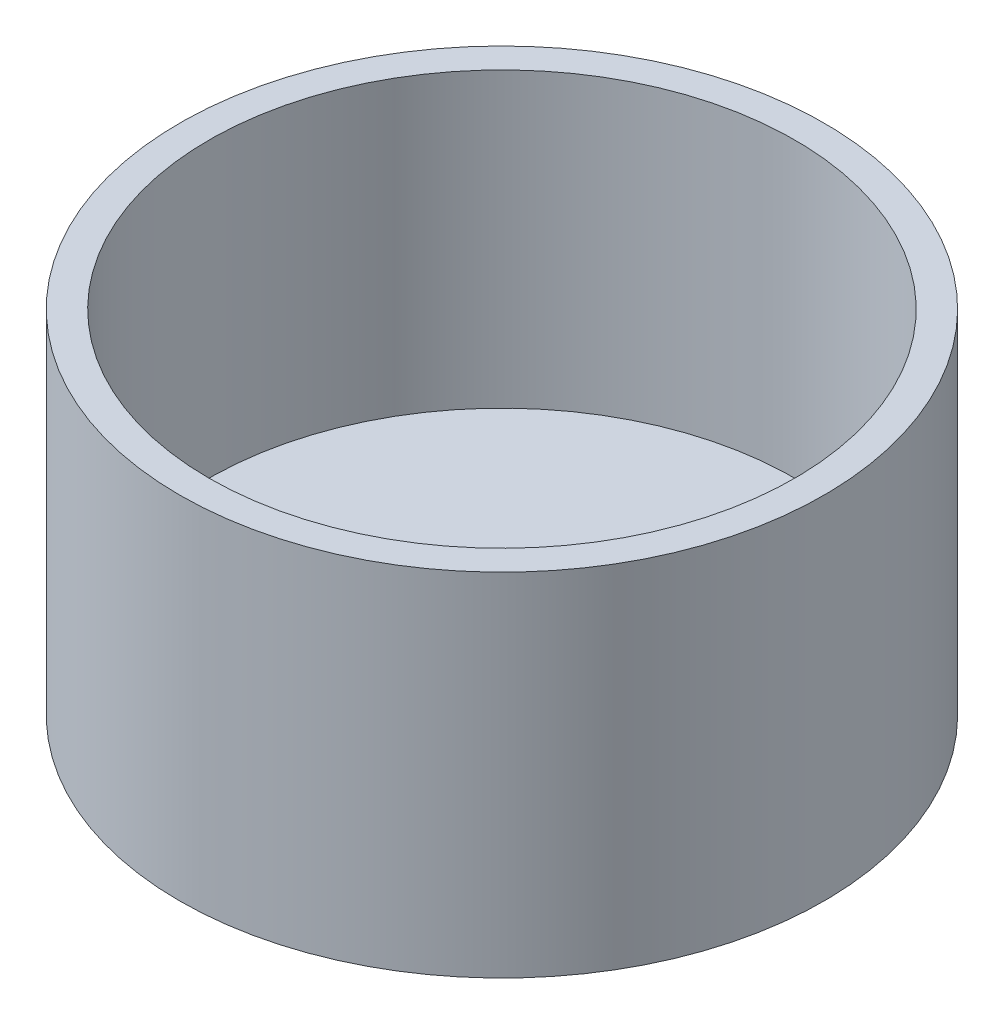
ISO-10303-21;
HEADER;
FILE_DESCRIPTION(('STEP AP214'),'2;1');
FILE_NAME('part.step','',(''),(''),'','','');
FILE_SCHEMA(('AUTOMOTIVE_DESIGN { 1 0 10303 214 1 1 1 1 }'));
ENDSEC;
DATA;
#1=APPLICATION_CONTEXT('core data for automotive mechanical design processes');
#2=APPLICATION_PROTOCOL_DEFINITION('international standard','automotive_design',2000,#1);
#3=PRODUCT_CONTEXT('',#1,'mechanical');
#4=PRODUCT('Part','Part','',(#3));
#5=PRODUCT_RELATED_PRODUCT_CATEGORY('part','',(#4));
#6=PRODUCT_DEFINITION_FORMATION('','',#4);
#7=PRODUCT_DEFINITION_CONTEXT('part definition',#1,'design');
#8=PRODUCT_DEFINITION('design','',#6,#7);
#9=PRODUCT_DEFINITION_SHAPE('','',#8);
#10=(LENGTH_UNIT() NAMED_UNIT(*) SI_UNIT(.MILLI.,.METRE.));
#11=(NAMED_UNIT(*) PLANE_ANGLE_UNIT() SI_UNIT($,.RADIAN.));
#12=(NAMED_UNIT(*) SI_UNIT($,.STERADIAN.) SOLID_ANGLE_UNIT());
#13=UNCERTAINTY_MEASURE_WITH_UNIT(LENGTH_MEASURE(1.E-05),#10,'distance_accuracy_value','');
#14=(GEOMETRIC_REPRESENTATION_CONTEXT(3) GLOBAL_UNCERTAINTY_ASSIGNED_CONTEXT((#13)) GLOBAL_UNIT_ASSIGNED_CONTEXT((#10,
#11,#12)) REPRESENTATION_CONTEXT('',''));
#15=CARTESIAN_POINT('',(0.,0.,0.));
#16=DIRECTION('',(0.,0.,1.));
#17=DIRECTION('',(1.,0.,0.));
#18=AXIS2_PLACEMENT_3D('',#15,#16,#17);
#19=CARTESIAN_POINT('',(0.,3.,0.));
#20=DIRECTION('',(0.,-1.,0.));
#21=DIRECTION('',(0.,0.,-1.));
#22=AXIS2_PLACEMENT_3D('',#19,#20,#21);
#23=CYLINDRICAL_SURFACE('',#22,0.75);
#24=CARTESIAN_POINT('',(0.,0.,0.));
#25=DIRECTION('',(0.,1.,0.));
#26=DIRECTION('',(0.,0.,1.));
#27=AXIS2_PLACEMENT_3D('',#24,#25,#26);
#28=CIRCLE('',#27,0.75);
#29=CARTESIAN_POINT('',(0.,0.,0.75));
#30=VERTEX_POINT('',#29);
#31=EDGE_CURVE('E56',#30,#30,#28,.T.);
#32=ORIENTED_EDGE('',*,*,#31,.F.);
#33=EDGE_LOOP('',(#32));
#34=FACE_BOUND('',#33,.T.);
#35=CARTESIAN_POINT('',(0.,0.5,0.));
#36=DIRECTION('',(0.,1.,0.));
#37=DIRECTION('',(0.,0.,1.));
#38=AXIS2_PLACEMENT_3D('',#35,#36,#37);
#39=CIRCLE('',#38,0.75);
#40=CARTESIAN_POINT('',(0.,0.5,0.75));
#41=VERTEX_POINT('',#40);
#42=EDGE_CURVE('E47',#41,#41,#39,.T.);
#43=ORIENTED_EDGE('',*,*,#42,.T.);
#44=EDGE_LOOP('',(#43));
#45=FACE_BOUND('',#44,.T.);
#46=ADVANCED_FACE('F43',(#34,#45),#23,.F.);
#47=CARTESIAN_POINT('',(0.,3.,0.));
#48=DIRECTION('',(0.,1.,0.));
#49=DIRECTION('',(0.,0.,1.));
#50=AXIS2_PLACEMENT_3D('',#47,#48,#49);
#51=PLANE('',#50);
#52=CARTESIAN_POINT('',(0.,3.,0.));
#53=DIRECTION('',(0.,1.,0.));
#54=DIRECTION('',(0.,0.,1.));
#55=AXIS2_PLACEMENT_3D('',#52,#53,#54);
#56=CIRCLE('',#55,2.5);
#57=CARTESIAN_POINT('',(0.,3.,2.5));
#58=VERTEX_POINT('',#57);
#59=EDGE_CURVE('E60',#58,#58,#56,.T.);
#60=ORIENTED_EDGE('',*,*,#59,.F.);
#61=EDGE_LOOP('',(#60));
#62=FACE_BOUND('',#61,.T.);
#63=CARTESIAN_POINT('',(0.,3.,0.));
#64=DIRECTION('',(0.,1.,0.));
#65=DIRECTION('',(0.,0.,1.));
#66=AXIS2_PLACEMENT_3D('',#63,#64,#65);
#67=CIRCLE('',#66,2.75);
#68=CARTESIAN_POINT('',(0.,3.,2.75));
#69=VERTEX_POINT('',#68);
#70=EDGE_CURVE('E10',#69,#69,#67,.T.);
#71=ORIENTED_EDGE('',*,*,#70,.T.);
#72=EDGE_LOOP('',(#71));
#73=FACE_BOUND('',#72,.T.);
#74=ADVANCED_FACE('F81',(#62,#73),#51,.T.);
#75=CARTESIAN_POINT('',(0.,0.,0.));
#76=DIRECTION('',(0.,1.,0.));
#77=DIRECTION('',(0.,0.,1.));
#78=AXIS2_PLACEMENT_3D('',#75,#76,#77);
#79=PLANE('',#78);
#80=CARTESIAN_POINT('',(0.,0.,0.));
#81=DIRECTION('',(0.,1.,0.));
#82=DIRECTION('',(0.,0.,1.));
#83=AXIS2_PLACEMENT_3D('',#80,#81,#82);
#84=CIRCLE('',#83,2.75);
#85=CARTESIAN_POINT('',(0.,0.,2.75));
#86=VERTEX_POINT('',#85);
#87=EDGE_CURVE('E51',#86,#86,#84,.T.);
#88=ORIENTED_EDGE('',*,*,#87,.F.);
#89=EDGE_LOOP('',(#88));
#90=FACE_BOUND('',#89,.T.);
#91=ORIENTED_EDGE('',*,*,#31,.T.);
#92=EDGE_LOOP('',(#91));
#93=FACE_BOUND('',#92,.T.);
#94=ADVANCED_FACE('F88',(#90,#93),#79,.F.);
#95=CARTESIAN_POINT('',(0.,3.,0.));
#96=DIRECTION('',(0.,-1.,0.));
#97=DIRECTION('',(0.,0.,-1.));
#98=AXIS2_PLACEMENT_3D('',#95,#96,#97);
#99=CYLINDRICAL_SURFACE('',#98,2.75);
#100=ORIENTED_EDGE('',*,*,#70,.F.);
#101=EDGE_LOOP('',(#100));
#102=FACE_BOUND('',#101,.T.);
#103=ORIENTED_EDGE('',*,*,#87,.T.);
#104=EDGE_LOOP('',(#103));
#105=FACE_BOUND('',#104,.T.);
#106=ADVANCED_FACE('F45',(#102,#105),#99,.T.);
#107=CARTESIAN_POINT('',(0.,0.5,0.));
#108=DIRECTION('',(0.,1.,0.));
#109=DIRECTION('',(0.,0.,1.));
#110=AXIS2_PLACEMENT_3D('',#107,#108,#109);
#111=CYLINDRICAL_SURFACE('',#110,2.5);
#112=CARTESIAN_POINT('',(0.,0.5,0.));
#113=DIRECTION('',(0.,1.,0.));
#114=DIRECTION('',(0.,0.,1.));
#115=AXIS2_PLACEMENT_3D('',#112,#113,#114);
#116=CIRCLE('',#115,2.5);
#117=CARTESIAN_POINT('',(0.,0.5,2.5));
#118=VERTEX_POINT('',#117);
#119=EDGE_CURVE('E63',#118,#118,#116,.T.);
#120=ORIENTED_EDGE('',*,*,#119,.F.);
#121=EDGE_LOOP('',(#120));
#122=FACE_BOUND('',#121,.T.);
#123=ORIENTED_EDGE('',*,*,#59,.T.);
#124=EDGE_LOOP('',(#123));
#125=FACE_BOUND('',#124,.T.);
#126=ADVANCED_FACE('F73',(#122,#125),#111,.F.);
#127=CARTESIAN_POINT('',(0.,0.5,0.));
#128=DIRECTION('',(0.,1.,0.));
#129=DIRECTION('',(0.,0.,1.));
#130=AXIS2_PLACEMENT_3D('',#127,#128,#129);
#131=PLANE('',#130);
#132=ORIENTED_EDGE('',*,*,#42,.F.);
#133=EDGE_LOOP('',(#132));
#134=FACE_BOUND('',#133,.T.);
#135=ORIENTED_EDGE('',*,*,#119,.T.);
#136=EDGE_LOOP('',(#135));
#137=FACE_BOUND('',#136,.T.);
#138=ADVANCED_FACE('F71',(#134,#137),#131,.T.);
#139=CLOSED_SHELL('',(#46,#74,#94,#106,#126,#138));
#140=MANIFOLD_SOLID_BREP('B2',#139);
#141=ADVANCED_BREP_SHAPE_REPRESENTATION('',(#18,#140),#14);
#142=SHAPE_DEFINITION_REPRESENTATION(#9,#141);
ENDSEC;
END-ISO-10303-21;
